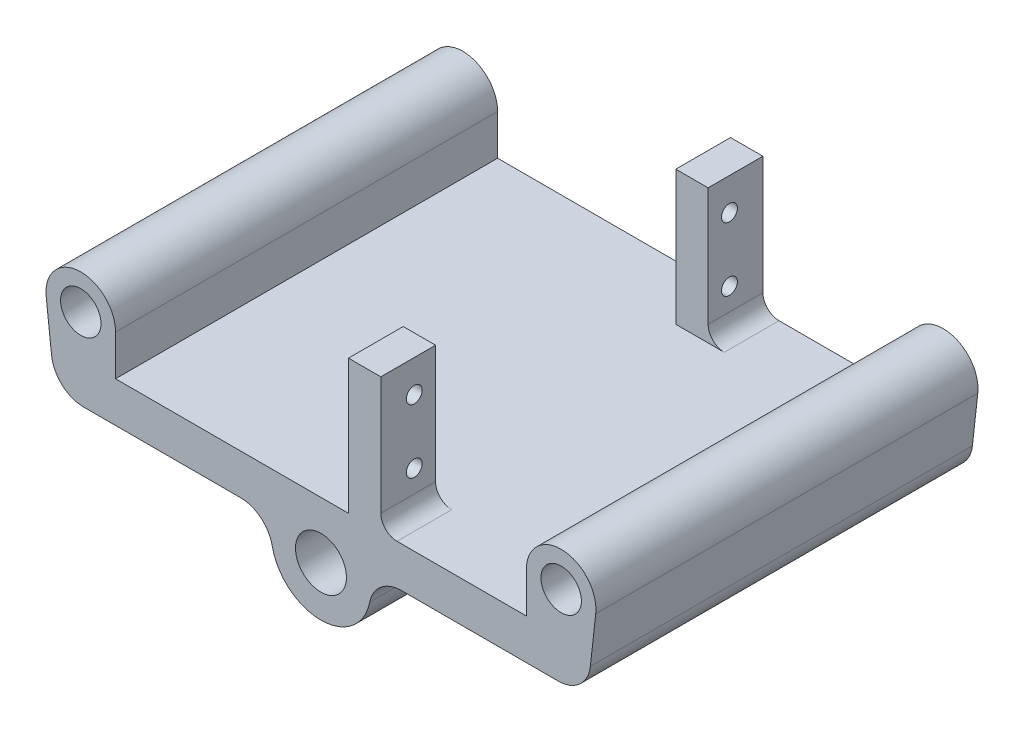
ISO-10303-21;
HEADER;
FILE_DESCRIPTION(('STEP AP214'),'2;1');
FILE_NAME('part.step','',(''),(''),'','','');
FILE_SCHEMA(('AUTOMOTIVE_DESIGN { 1 0 10303 214 1 1 1 1 }'));
ENDSEC;
DATA;
#1=APPLICATION_CONTEXT('core data for automotive mechanical design processes');
#2=APPLICATION_PROTOCOL_DEFINITION('international standard','automotive_design',2000,#1);
#3=PRODUCT_CONTEXT('',#1,'mechanical');
#4=PRODUCT('Part','Part','',(#3));
#5=PRODUCT_RELATED_PRODUCT_CATEGORY('part','',(#4));
#6=PRODUCT_DEFINITION_FORMATION('','',#4);
#7=PRODUCT_DEFINITION_CONTEXT('part definition',#1,'design');
#8=PRODUCT_DEFINITION('design','',#6,#7);
#9=PRODUCT_DEFINITION_SHAPE('','',#8);
#10=(LENGTH_UNIT() NAMED_UNIT(*) SI_UNIT(.MILLI.,.METRE.));
#11=(NAMED_UNIT(*) PLANE_ANGLE_UNIT() SI_UNIT($,.RADIAN.));
#12=(NAMED_UNIT(*) SI_UNIT($,.STERADIAN.) SOLID_ANGLE_UNIT());
#13=UNCERTAINTY_MEASURE_WITH_UNIT(LENGTH_MEASURE(1.E-05),#10,'distance_accuracy_value','');
#14=(GEOMETRIC_REPRESENTATION_CONTEXT(3) GLOBAL_UNCERTAINTY_ASSIGNED_CONTEXT((#13)) GLOBAL_UNIT_ASSIGNED_CONTEXT((#10,
#11,#12)) REPRESENTATION_CONTEXT('',''));
#15=CARTESIAN_POINT('',(0.,0.,0.));
#16=DIRECTION('',(0.,0.,1.));
#17=DIRECTION('',(1.,0.,0.));
#18=AXIS2_PLACEMENT_3D('',#15,#16,#17);
#19=CARTESIAN_POINT('',(32.258,6.35,60.));
#20=DIRECTION('',(0.,-1.,0.));
#21=DIRECTION('',(1.,0.,0.));
#22=AXIS2_PLACEMENT_3D('',#19,#20,#21);
#23=PLANE('',#22);
#24=DIRECTION('',(-1.,0.,0.));
#25=VECTOR('',#24,1.);
#26=CARTESIAN_POINT('',(32.258,6.35,0.));
#27=LINE('',#26,#25);
#28=CARTESIAN_POINT('',(32.258,6.35,0.));
#29=VERTEX_POINT('',#28);
#30=CARTESIAN_POINT('',(11.938,6.35,0.));
#31=VERTEX_POINT('',#30);
#32=EDGE_CURVE('E350',#29,#31,#27,.T.);
#33=ORIENTED_EDGE('',*,*,#32,.T.);
#34=DIRECTION('',(0.,0.,-1.));
#35=VECTOR('',#34,1.);
#36=CARTESIAN_POINT('',(11.938,6.35,8.6));
#37=LINE('',#36,#35);
#38=CARTESIAN_POINT('',(11.938,6.35,8.6));
#39=VERTEX_POINT('',#38);
#40=EDGE_CURVE('E398',#31,#39,#37,.F.);
#41=ORIENTED_EDGE('',*,*,#40,.T.);
#42=DIRECTION('',(1.,0.,0.));
#43=VECTOR('',#42,1.);
#44=CARTESIAN_POINT('',(4.31799999999999,6.35,8.6));
#45=LINE('',#44,#43);
#46=CARTESIAN_POINT('',(4.31799999999999,6.35,8.6));
#47=VERTEX_POINT('',#46);
#48=EDGE_CURVE('E235',#47,#39,#45,.T.);
#49=ORIENTED_EDGE('',*,*,#48,.F.);
#50=DIRECTION('',(0.,0.,1.));
#51=VECTOR('',#50,1.);
#52=CARTESIAN_POINT('',(4.31799999999998,6.35,0.));
#53=LINE('',#52,#51);
#54=CARTESIAN_POINT('',(4.31799999999998,6.35,0.));
#55=VERTEX_POINT('',#54);
#56=EDGE_CURVE('E230',#55,#47,#53,.T.);
#57=ORIENTED_EDGE('',*,*,#56,.F.);
#58=CARTESIAN_POINT('',(-32.258,6.35,0.));
#59=VERTEX_POINT('',#58);
#60=EDGE_CURVE('E376',#55,#59,#27,.T.);
#61=ORIENTED_EDGE('',*,*,#60,.T.);
#62=DIRECTION('',(0.,0.,-1.));
#63=VECTOR('',#62,1.);
#64=CARTESIAN_POINT('',(-32.258,6.35,60.));
#65=LINE('',#64,#63);
#66=CARTESIAN_POINT('',(-32.258,6.35,60.));
#67=VERTEX_POINT('',#66);
#68=EDGE_CURVE('E317',#67,#59,#65,.T.);
#69=ORIENTED_EDGE('',*,*,#68,.F.);
#70=DIRECTION('',(-1.,0.,0.));
#71=VECTOR('',#70,1.);
#72=CARTESIAN_POINT('',(32.258,6.35,60.));
#73=LINE('',#72,#71);
#74=CARTESIAN_POINT('',(4.31799999999998,6.35,60.));
#75=VERTEX_POINT('',#74);
#76=EDGE_CURVE('E359',#75,#67,#73,.T.);
#77=ORIENTED_EDGE('',*,*,#76,.F.);
#78=DIRECTION('',(0.,0.,1.));
#79=VECTOR('',#78,1.);
#80=CARTESIAN_POINT('',(4.31799999999999,6.35,51.4));
#81=LINE('',#80,#79);
#82=CARTESIAN_POINT('',(4.31799999999999,6.35,51.4));
#83=VERTEX_POINT('',#82);
#84=EDGE_CURVE('E228',#83,#75,#81,.T.);
#85=ORIENTED_EDGE('',*,*,#84,.F.);
#86=DIRECTION('',(-1.,0.,0.));
#87=VECTOR('',#86,1.);
#88=CARTESIAN_POINT('',(4.31799999999999,6.35,51.4));
#89=LINE('',#88,#87);
#90=CARTESIAN_POINT('',(11.938,6.35,51.4));
#91=VERTEX_POINT('',#90);
#92=EDGE_CURVE('E224',#91,#83,#89,.T.);
#93=ORIENTED_EDGE('',*,*,#92,.F.);
#94=DIRECTION('',(0.,0.,-1.));
#95=VECTOR('',#94,1.);
#96=CARTESIAN_POINT('',(11.938,6.35,60.));
#97=LINE('',#96,#95);
#98=CARTESIAN_POINT('',(11.938,6.35,60.));
#99=VERTEX_POINT('',#98);
#100=EDGE_CURVE('E395',#91,#99,#97,.F.);
#101=ORIENTED_EDGE('',*,*,#100,.T.);
#102=CARTESIAN_POINT('',(32.258,6.35,60.));
#103=VERTEX_POINT('',#102);
#104=EDGE_CURVE('E360',#103,#99,#73,.T.);
#105=ORIENTED_EDGE('',*,*,#104,.F.);
#106=DIRECTION('',(0.,0.,-1.));
#107=VECTOR('',#106,1.);
#108=CARTESIAN_POINT('',(32.258,6.35,60.));
#109=LINE('',#108,#107);
#110=EDGE_CURVE('E364',#103,#29,#109,.T.);
#111=ORIENTED_EDGE('',*,*,#110,.T.);
#112=EDGE_LOOP('',(#33,#41,#49,#57,#61,#69,#77,#85,#93,#101,#105,#111));
#113=FACE_BOUND('',#112,.T.);
#114=ADVANCED_FACE('F39',(#113),#23,.F.);
#115=CARTESIAN_POINT('',(0.,0.,60.));
#116=DIRECTION('',(0.,-1.,0.));
#117=DIRECTION('',(0.,0.,-1.));
#118=AXIS2_PLACEMENT_3D('',#115,#116,#117);
#119=PLANE('',#118);
#120=DIRECTION('',(-1.,0.,0.));
#121=VECTOR('',#120,1.);
#122=CARTESIAN_POINT('',(0.,0.,60.));
#123=LINE('',#122,#121);
#124=CARTESIAN_POINT('',(-12.6372663183143,0.,60.));
#125=VERTEX_POINT('',#124);
#126=CARTESIAN_POINT('',(-37.2549490920751,0.,60.));
#127=VERTEX_POINT('',#126);
#128=EDGE_CURVE('E293',#125,#127,#123,.T.);
#129=ORIENTED_EDGE('',*,*,#128,.T.);
#130=DIRECTION('',(0.,0.,-1.));
#131=VECTOR('',#130,1.);
#132=CARTESIAN_POINT('',(-37.2549490920751,0.,60.));
#133=LINE('',#132,#131);
#134=CARTESIAN_POINT('',(-37.2549490920751,0.,0.));
#135=VERTEX_POINT('',#134);
#136=EDGE_CURVE('E445',#127,#135,#133,.T.);
#137=ORIENTED_EDGE('',*,*,#136,.T.);
#138=DIRECTION('',(-1.,0.,0.));
#139=VECTOR('',#138,1.);
#140=CARTESIAN_POINT('',(0.,0.,0.));
#141=LINE('',#140,#139);
#142=CARTESIAN_POINT('',(-12.6372663183143,0.,0.));
#143=VERTEX_POINT('',#142);
#144=EDGE_CURVE('E286',#143,#135,#141,.T.);
#145=ORIENTED_EDGE('',*,*,#144,.F.);
#146=DIRECTION('',(0.,0.,1.));
#147=VECTOR('',#146,1.);
#148=CARTESIAN_POINT('',(-12.6372663183143,0.,60.));
#149=LINE('',#148,#147);
#150=EDGE_CURVE('E426',#143,#125,#149,.T.);
#151=ORIENTED_EDGE('',*,*,#150,.T.);
#152=EDGE_LOOP('',(#129,#137,#145,#151));
#153=FACE_BOUND('',#152,.T.);
#154=ADVANCED_FACE('F591',(#153),#119,.T.);
#155=CARTESIAN_POINT('',(37.719,12.7,60.));
#156=DIRECTION('',(0.,0.,1.));
#157=DIRECTION('',(1.,0.,0.));
#158=AXIS2_PLACEMENT_3D('',#155,#156,#157);
#159=PLANE('',#158);
#160=DIRECTION('',(-0.110525955178562,0.99387323800969,0.));
#161=VECTOR('',#160,1.);
#162=CARTESIAN_POINT('',(-41.8013318448109,0.,60.));
#163=LINE('',#162,#161);
#164=CARTESIAN_POINT('',(-42.3038251411643,4.5185281476929,60.));
#165=VERTEX_POINT('',#164);
#166=CARTESIAN_POINT('',(-43.1465417527709,12.0964177587699,60.));
#167=VERTEX_POINT('',#166);
#168=EDGE_CURVE('E290',#165,#167,#163,.T.);
#169=ORIENTED_EDGE('',*,*,#168,.F.);
#170=CARTESIAN_POINT('',(-37.2549490920751,5.08,60.));
#171=DIRECTION('',(0.,0.,1.));
#172=DIRECTION('',(1.,0.,0.));
#173=AXIS2_PLACEMENT_3D('',#170,#171,#172);
#174=CIRCLE('',#173,5.08);
#175=EDGE_CURVE('E460',#165,#127,#174,.T.);
#176=ORIENTED_EDGE('',*,*,#175,.T.);
#177=ORIENTED_EDGE('',*,*,#128,.F.);
#178=CARTESIAN_POINT('',(-12.6372663183143,-5.08,60.));
#179=DIRECTION('',(0.,0.,1.));
#180=DIRECTION('',(1.,0.,0.));
#181=AXIS2_PLACEMENT_3D('',#178,#179,#180);
#182=CIRCLE('',#181,5.08);
#183=CARTESIAN_POINT('',(-7.65686966222144,-4.07897595034911,60.));
#184=VERTEX_POINT('',#183);
#185=EDGE_CURVE('E436',#125,#184,#182,.F.);
#186=ORIENTED_EDGE('',*,*,#185,.T.);
#187=CARTESIAN_POINT('',(0.,-2.54,60.));
#188=DIRECTION('',(0.,0.,1.));
#189=DIRECTION('',(1.,0.,0.));
#190=AXIS2_PLACEMENT_3D('',#187,#188,#189);
#191=CIRCLE('',#190,7.81);
#192=CARTESIAN_POINT('',(7.65686966222144,-4.07897595034911,60.));
#193=VERTEX_POINT('',#192);
#194=EDGE_CURVE('E325',#193,#184,#191,.F.);
#195=ORIENTED_EDGE('',*,*,#194,.F.);
#196=CARTESIAN_POINT('',(12.6372663183143,-5.08,60.));
#197=DIRECTION('',(0.,0.,1.));
#198=DIRECTION('',(1.,0.,0.));
#199=AXIS2_PLACEMENT_3D('',#196,#197,#198);
#200=CIRCLE('',#199,5.08);
#201=CARTESIAN_POINT('',(12.6372663183143,0.,60.));
#202=VERTEX_POINT('',#201);
#203=EDGE_CURVE('E442',#193,#202,#200,.F.);
#204=ORIENTED_EDGE('',*,*,#203,.T.);
#205=DIRECTION('',(1.,0.,0.));
#206=VECTOR('',#205,1.);
#207=CARTESIAN_POINT('',(0.,0.,60.));
#208=LINE('',#207,#206);
#209=CARTESIAN_POINT('',(37.2549490920751,0.,60.));
#210=VERTEX_POINT('',#209);
#211=EDGE_CURVE('E346',#202,#210,#208,.T.);
#212=ORIENTED_EDGE('',*,*,#211,.T.);
#213=CARTESIAN_POINT('',(37.2549490920751,5.08,60.));
#214=DIRECTION('',(0.,0.,1.));
#215=DIRECTION('',(1.,0.,0.));
#216=AXIS2_PLACEMENT_3D('',#213,#214,#215);
#217=CIRCLE('',#216,5.08);
#218=CARTESIAN_POINT('',(42.3038251411643,4.5185281476929,60.));
#219=VERTEX_POINT('',#218);
#220=EDGE_CURVE('E55',#210,#219,#217,.T.);
#221=ORIENTED_EDGE('',*,*,#220,.T.);
#222=DIRECTION('',(0.110525955178562,0.99387323800969,0.));
#223=VECTOR('',#222,1.);
#224=CARTESIAN_POINT('',(41.8013318448109,0.,60.));
#225=LINE('',#224,#223);
#226=CARTESIAN_POINT('',(43.1465417527709,12.0964177587699,60.));
#227=VERTEX_POINT('',#226);
#228=EDGE_CURVE('E349',#219,#227,#225,.T.);
#229=ORIENTED_EDGE('',*,*,#228,.T.);
#230=CARTESIAN_POINT('',(37.719,12.7,60.));
#231=DIRECTION('',(0.,0.,1.));
#232=DIRECTION('',(1.,0.,0.));
#233=AXIS2_PLACEMENT_3D('',#230,#231,#232);
#234=CIRCLE('',#233,5.461);
#235=CARTESIAN_POINT('',(32.258,12.7,60.));
#236=VERTEX_POINT('',#235);
#237=EDGE_CURVE('E353',#227,#236,#234,.T.);
#238=ORIENTED_EDGE('',*,*,#237,.T.);
#239=DIRECTION('',(0.,-1.,0.));
#240=VECTOR('',#239,1.);
#241=CARTESIAN_POINT('',(32.258,12.7,60.));
#242=LINE('',#241,#240);
#243=EDGE_CURVE('E356',#236,#103,#242,.T.);
#244=ORIENTED_EDGE('',*,*,#243,.T.);
#245=ORIENTED_EDGE('',*,*,#104,.T.);
#246=CARTESIAN_POINT('',(11.938,8.89,60.));
#247=DIRECTION('',(0.,0.,1.));
#248=DIRECTION('',(1.,0.,0.));
#249=AXIS2_PLACEMENT_3D('',#246,#247,#248);
#250=CIRCLE('',#249,2.54);
#251=CARTESIAN_POINT('',(9.39799999999999,8.89,60.));
#252=VERTEX_POINT('',#251);
#253=EDGE_CURVE('E416',#99,#252,#250,.F.);
#254=ORIENTED_EDGE('',*,*,#253,.T.);
#255=DIRECTION('',(0.,-1.,0.));
#256=VECTOR('',#255,1.);
#257=CARTESIAN_POINT('',(9.39799999999999,27.45,60.));
#258=LINE('',#257,#256);
#259=CARTESIAN_POINT('',(9.39799999999999,27.45,60.));
#260=VERTEX_POINT('',#259);
#261=EDGE_CURVE('E209',#260,#252,#258,.T.);
#262=ORIENTED_EDGE('',*,*,#261,.F.);
#263=DIRECTION('',(1.,0.,0.));
#264=VECTOR('',#263,1.);
#265=CARTESIAN_POINT('',(4.31799999999998,27.45,60.));
#266=LINE('',#265,#264);
#267=CARTESIAN_POINT('',(4.31799999999998,27.45,60.));
#268=VERTEX_POINT('',#267);
#269=EDGE_CURVE('E200',#268,#260,#266,.T.);
#270=ORIENTED_EDGE('',*,*,#269,.F.);
#271=DIRECTION('',(0.,-1.,0.));
#272=VECTOR('',#271,1.);
#273=CARTESIAN_POINT('',(4.31799999999998,27.45,60.));
#274=LINE('',#273,#272);
#275=EDGE_CURVE('E206',#268,#75,#274,.T.);
#276=ORIENTED_EDGE('',*,*,#275,.T.);
#277=ORIENTED_EDGE('',*,*,#76,.T.);
#278=DIRECTION('',(0.,-1.,0.));
#279=VECTOR('',#278,1.);
#280=CARTESIAN_POINT('',(-32.258,12.7,60.));
#281=LINE('',#280,#279);
#282=CARTESIAN_POINT('',(-32.258,12.7,60.));
#283=VERTEX_POINT('',#282);
#284=EDGE_CURVE('E281',#283,#67,#281,.T.);
#285=ORIENTED_EDGE('',*,*,#284,.F.);
#286=CARTESIAN_POINT('',(-37.719,12.7,60.));
#287=DIRECTION('',(0.,0.,-1.));
#288=DIRECTION('',(-1.,0.,0.));
#289=AXIS2_PLACEMENT_3D('',#286,#287,#288);
#290=CIRCLE('',#289,5.461);
#291=EDGE_CURVE('E285',#167,#283,#290,.T.);
#292=ORIENTED_EDGE('',*,*,#291,.F.);
#293=EDGE_LOOP('',(#169,#176,#177,#186,#195,#204,#212,#221,#229,#238,#244,#245,#254,#262,#270,
#276,#277,#285,#292));
#294=FACE_BOUND('',#293,.T.);
#295=CARTESIAN_POINT('',(37.719,12.7,60.));
#296=DIRECTION('',(0.,0.,1.));
#297=DIRECTION('',(1.,0.,0.));
#298=AXIS2_PLACEMENT_3D('',#295,#296,#297);
#299=CIRCLE('',#298,3.175);
#300=CARTESIAN_POINT('',(40.894,12.7,60.));
#301=VERTEX_POINT('',#300);
#302=EDGE_CURVE('E338',#301,#301,#299,.T.);
#303=ORIENTED_EDGE('',*,*,#302,.F.);
#304=EDGE_LOOP('',(#303));
#305=FACE_BOUND('',#304,.T.);
#306=CARTESIAN_POINT('',(-37.719,12.7,60.));
#307=DIRECTION('',(0.,0.,-1.));
#308=DIRECTION('',(-1.,0.,0.));
#309=AXIS2_PLACEMENT_3D('',#306,#307,#308);
#310=CIRCLE('',#309,3.175);
#311=CARTESIAN_POINT('',(-40.894,12.7,60.));
#312=VERTEX_POINT('',#311);
#313=EDGE_CURVE('E273',#312,#312,#310,.T.);
#314=ORIENTED_EDGE('',*,*,#313,.T.);
#315=EDGE_LOOP('',(#314));
#316=FACE_BOUND('',#315,.T.);
#317=CARTESIAN_POINT('',(0.,-2.54,60.));
#318=DIRECTION('',(0.,0.,-1.));
#319=DIRECTION('',(-1.,0.,0.));
#320=AXIS2_PLACEMENT_3D('',#317,#318,#319);
#321=CIRCLE('',#320,4.);
#322=CARTESIAN_POINT('',(-4.,-2.54,60.));
#323=VERTEX_POINT('',#322);
#324=EDGE_CURVE('E330',#323,#323,#321,.T.);
#325=ORIENTED_EDGE('',*,*,#324,.T.);
#326=EDGE_LOOP('',(#325));
#327=FACE_BOUND('',#326,.T.);
#328=ADVANCED_FACE('F203',(#294,#305,#316,#327),#159,.T.);
#329=CARTESIAN_POINT('',(37.719,12.7,0.));
#330=DIRECTION('',(0.,0.,1.));
#331=DIRECTION('',(1.,0.,0.));
#332=AXIS2_PLACEMENT_3D('',#329,#330,#331);
#333=PLANE('',#332);
#334=ORIENTED_EDGE('',*,*,#144,.T.);
#335=CARTESIAN_POINT('',(-37.2549490920751,5.08,0.));
#336=DIRECTION('',(0.,0.,1.));
#337=DIRECTION('',(1.,0.,0.));
#338=AXIS2_PLACEMENT_3D('',#335,#336,#337);
#339=CIRCLE('',#338,5.08);
#340=CARTESIAN_POINT('',(-42.3038251411643,4.5185281476929,0.));
#341=VERTEX_POINT('',#340);
#342=EDGE_CURVE('E452',#135,#341,#339,.F.);
#343=ORIENTED_EDGE('',*,*,#342,.T.);
#344=DIRECTION('',(-0.110525955178562,0.99387323800969,0.));
#345=VECTOR('',#344,1.);
#346=CARTESIAN_POINT('',(-41.8013318448109,0.,0.));
#347=LINE('',#346,#345);
#348=CARTESIAN_POINT('',(-43.1465417527709,12.0964177587699,0.));
#349=VERTEX_POINT('',#348);
#350=EDGE_CURVE('E305',#341,#349,#347,.T.);
#351=ORIENTED_EDGE('',*,*,#350,.T.);
#352=CARTESIAN_POINT('',(-37.719,12.7,0.));
#353=DIRECTION('',(0.,0.,-1.));
#354=DIRECTION('',(-1.,0.,0.));
#355=AXIS2_PLACEMENT_3D('',#352,#353,#354);
#356=CIRCLE('',#355,5.461);
#357=CARTESIAN_POINT('',(-32.258,12.7,0.));
#358=VERTEX_POINT('',#357);
#359=EDGE_CURVE('E301',#349,#358,#356,.T.);
#360=ORIENTED_EDGE('',*,*,#359,.T.);
#361=DIRECTION('',(0.,-1.,0.));
#362=VECTOR('',#361,1.);
#363=CARTESIAN_POINT('',(-32.258,12.7,0.));
#364=LINE('',#363,#362);
#365=EDGE_CURVE('E277',#358,#59,#364,.T.);
#366=ORIENTED_EDGE('',*,*,#365,.T.);
#367=ORIENTED_EDGE('',*,*,#60,.F.);
#368=DIRECTION('',(0.,-1.,0.));
#369=VECTOR('',#368,1.);
#370=CARTESIAN_POINT('',(4.31799999999998,27.45,0.));
#371=LINE('',#370,#369);
#372=CARTESIAN_POINT('',(4.31799999999998,27.45,0.));
#373=VERTEX_POINT('',#372);
#374=EDGE_CURVE('E253',#373,#55,#371,.T.);
#375=ORIENTED_EDGE('',*,*,#374,.F.);
#376=DIRECTION('',(-1.,0.,0.));
#377=VECTOR('',#376,1.);
#378=CARTESIAN_POINT('',(4.31799999999998,27.45,0.));
#379=LINE('',#378,#377);
#380=CARTESIAN_POINT('',(9.39799999999998,27.45,0.));
#381=VERTEX_POINT('',#380);
#382=EDGE_CURVE('E251',#381,#373,#379,.T.);
#383=ORIENTED_EDGE('',*,*,#382,.F.);
#384=DIRECTION('',(0.,-1.,0.));
#385=VECTOR('',#384,1.);
#386=CARTESIAN_POINT('',(9.39799999999998,27.45,0.));
#387=LINE('',#386,#385);
#388=CARTESIAN_POINT('',(9.39799999999999,8.89,0.));
#389=VERTEX_POINT('',#388);
#390=EDGE_CURVE('E260',#381,#389,#387,.T.);
#391=ORIENTED_EDGE('',*,*,#390,.T.);
#392=CARTESIAN_POINT('',(11.938,8.89,0.));
#393=DIRECTION('',(0.,0.,1.));
#394=DIRECTION('',(1.,0.,0.));
#395=AXIS2_PLACEMENT_3D('',#392,#393,#394);
#396=CIRCLE('',#395,2.54);
#397=EDGE_CURVE('E406',#389,#31,#396,.T.);
#398=ORIENTED_EDGE('',*,*,#397,.T.);
#399=ORIENTED_EDGE('',*,*,#32,.F.);
#400=DIRECTION('',(0.,-1.,0.));
#401=VECTOR('',#400,1.);
#402=CARTESIAN_POINT('',(32.258,12.7,0.));
#403=LINE('',#402,#401);
#404=CARTESIAN_POINT('',(32.258,12.7,0.));
#405=VERTEX_POINT('',#404);
#406=EDGE_CURVE('E373',#405,#29,#403,.T.);
#407=ORIENTED_EDGE('',*,*,#406,.F.);
#408=CARTESIAN_POINT('',(37.719,12.7,0.));
#409=DIRECTION('',(0.,0.,1.));
#410=DIRECTION('',(1.,0.,0.));
#411=AXIS2_PLACEMENT_3D('',#408,#409,#410);
#412=CIRCLE('',#411,5.461);
#413=CARTESIAN_POINT('',(43.1465417527709,12.0964177587699,0.));
#414=VERTEX_POINT('',#413);
#415=EDGE_CURVE('E370',#414,#405,#412,.T.);
#416=ORIENTED_EDGE('',*,*,#415,.F.);
#417=DIRECTION('',(0.110525955178562,0.99387323800969,0.));
#418=VECTOR('',#417,1.);
#419=CARTESIAN_POINT('',(41.8013318448109,0.,0.));
#420=LINE('',#419,#418);
#421=CARTESIAN_POINT('',(42.3038251411643,4.5185281476929,0.));
#422=VERTEX_POINT('',#421);
#423=EDGE_CURVE('E367',#422,#414,#420,.T.);
#424=ORIENTED_EDGE('',*,*,#423,.F.);
#425=CARTESIAN_POINT('',(37.2549490920751,5.08,0.));
#426=DIRECTION('',(0.,0.,1.));
#427=DIRECTION('',(1.,0.,0.));
#428=AXIS2_PLACEMENT_3D('',#425,#426,#427);
#429=CIRCLE('',#428,5.08);
#430=CARTESIAN_POINT('',(37.2549490920751,0.,0.));
#431=VERTEX_POINT('',#430);
#432=EDGE_CURVE('E449',#422,#431,#429,.F.);
#433=ORIENTED_EDGE('',*,*,#432,.T.);
#434=DIRECTION('',(1.,0.,0.));
#435=VECTOR('',#434,1.);
#436=CARTESIAN_POINT('',(0.,0.,0.));
#437=LINE('',#436,#435);
#438=CARTESIAN_POINT('',(12.6372663183143,0.,0.));
#439=VERTEX_POINT('',#438);
#440=EDGE_CURVE('E342',#439,#431,#437,.T.);
#441=ORIENTED_EDGE('',*,*,#440,.F.);
#442=CARTESIAN_POINT('',(12.6372663183143,-5.08,0.));
#443=DIRECTION('',(0.,0.,1.));
#444=DIRECTION('',(1.,0.,0.));
#445=AXIS2_PLACEMENT_3D('',#442,#443,#444);
#446=CIRCLE('',#445,5.08);
#447=CARTESIAN_POINT('',(7.65686966222144,-4.07897595034911,0.));
#448=VERTEX_POINT('',#447);
#449=EDGE_CURVE('E439',#439,#448,#446,.T.);
#450=ORIENTED_EDGE('',*,*,#449,.T.);
#451=CARTESIAN_POINT('',(0.,-2.54,0.));
#452=DIRECTION('',(0.,0.,-1.));
#453=DIRECTION('',(-1.,0.,0.));
#454=AXIS2_PLACEMENT_3D('',#451,#452,#453);
#455=CIRCLE('',#454,7.81);
#456=CARTESIAN_POINT('',(-7.65686966222144,-4.07897595034911,0.));
#457=VERTEX_POINT('',#456);
#458=EDGE_CURVE('E321',#448,#457,#455,.T.);
#459=ORIENTED_EDGE('',*,*,#458,.T.);
#460=CARTESIAN_POINT('',(-12.6372663183143,-5.08,0.));
#461=DIRECTION('',(0.,0.,1.));
#462=DIRECTION('',(1.,0.,0.));
#463=AXIS2_PLACEMENT_3D('',#460,#461,#462);
#464=CIRCLE('',#463,5.08);
#465=EDGE_CURVE('E433',#457,#143,#464,.T.);
#466=ORIENTED_EDGE('',*,*,#465,.T.);
#467=EDGE_LOOP('',(#334,#343,#351,#360,#366,#367,#375,#383,#391,#398,#399,#407,#416,#424,#433,
#441,#450,#459,#466));
#468=FACE_BOUND('',#467,.T.);
#469=CARTESIAN_POINT('',(-37.719,12.7,0.));
#470=DIRECTION('',(0.,0.,-1.));
#471=DIRECTION('',(-1.,0.,0.));
#472=AXIS2_PLACEMENT_3D('',#469,#470,#471);
#473=CIRCLE('',#472,3.175);
#474=CARTESIAN_POINT('',(-40.894,12.7,0.));
#475=VERTEX_POINT('',#474);
#476=EDGE_CURVE('E272',#475,#475,#473,.T.);
#477=ORIENTED_EDGE('',*,*,#476,.F.);
#478=EDGE_LOOP('',(#477));
#479=FACE_BOUND('',#478,.T.);
#480=CARTESIAN_POINT('',(37.719,12.7,0.));
#481=DIRECTION('',(0.,0.,1.));
#482=DIRECTION('',(1.,0.,0.));
#483=AXIS2_PLACEMENT_3D('',#480,#481,#482);
#484=CIRCLE('',#483,3.175);
#485=CARTESIAN_POINT('',(40.894,12.7,0.));
#486=VERTEX_POINT('',#485);
#487=EDGE_CURVE('E334',#486,#486,#484,.T.);
#488=ORIENTED_EDGE('',*,*,#487,.T.);
#489=EDGE_LOOP('',(#488));
#490=FACE_BOUND('',#489,.T.);
#491=CARTESIAN_POINT('',(0.,-2.54,0.));
#492=DIRECTION('',(0.,0.,-1.));
#493=DIRECTION('',(-1.,0.,0.));
#494=AXIS2_PLACEMENT_3D('',#491,#492,#493);
#495=CIRCLE('',#494,4.);
#496=CARTESIAN_POINT('',(-4.,-2.54,0.));
#497=VERTEX_POINT('',#496);
#498=EDGE_CURVE('E329',#497,#497,#495,.T.);
#499=ORIENTED_EDGE('',*,*,#498,.F.);
#500=EDGE_LOOP('',(#499));
#501=FACE_BOUND('',#500,.T.);
#502=ADVANCED_FACE('F472',(#468,#479,#490,#501),#333,.F.);
#503=CARTESIAN_POINT('',(0.,0.,60.));
#504=DIRECTION('',(0.,1.,0.));
#505=DIRECTION('',(0.,0.,1.));
#506=AXIS2_PLACEMENT_3D('',#503,#504,#505);
#507=PLANE('',#506);
#508=ORIENTED_EDGE('',*,*,#440,.T.);
#509=DIRECTION('',(0.,0.,-1.));
#510=VECTOR('',#509,1.);
#511=CARTESIAN_POINT('',(37.2549490920751,0.,60.));
#512=LINE('',#511,#510);
#513=EDGE_CURVE('E11',#431,#210,#512,.F.);
#514=ORIENTED_EDGE('',*,*,#513,.T.);
#515=ORIENTED_EDGE('',*,*,#211,.F.);
#516=DIRECTION('',(0.,0.,-1.));
#517=VECTOR('',#516,1.);
#518=CARTESIAN_POINT('',(12.6372663183143,0.,60.));
#519=LINE('',#518,#517);
#520=EDGE_CURVE('E429',#202,#439,#519,.T.);
#521=ORIENTED_EDGE('',*,*,#520,.T.);
#522=EDGE_LOOP('',(#508,#514,#515,#521));
#523=FACE_BOUND('',#522,.T.);
#524=ADVANCED_FACE('F607',(#523),#507,.F.);
#525=CARTESIAN_POINT('',(41.8013318448109,0.,60.));
#526=DIRECTION('',(-0.99387323800969,0.110525955178562,0.));
#527=DIRECTION('',(-0.110525955178562,-0.99387323800969,0.));
#528=AXIS2_PLACEMENT_3D('',#525,#526,#527);
#529=PLANE('',#528);
#530=ORIENTED_EDGE('',*,*,#228,.F.);
#531=DIRECTION('',(0.,0.,-1.));
#532=VECTOR('',#531,1.);
#533=CARTESIAN_POINT('',(42.3038251411643,4.5185281476929,60.));
#534=LINE('',#533,#532);
#535=EDGE_CURVE('E48',#219,#422,#534,.T.);
#536=ORIENTED_EDGE('',*,*,#535,.T.);
#537=ORIENTED_EDGE('',*,*,#423,.T.);
#538=DIRECTION('',(0.,0.,-1.));
#539=VECTOR('',#538,1.);
#540=CARTESIAN_POINT('',(43.1465417527709,12.0964177587699,60.));
#541=LINE('',#540,#539);
#542=EDGE_CURVE('E387',#227,#414,#541,.T.);
#543=ORIENTED_EDGE('',*,*,#542,.F.);
#544=EDGE_LOOP('',(#530,#536,#537,#543));
#545=FACE_BOUND('',#544,.T.);
#546=ADVANCED_FACE('F467',(#545),#529,.F.);
#547=CARTESIAN_POINT('',(37.719,12.7,60.));
#548=DIRECTION('',(0.,0.,-1.));
#549=DIRECTION('',(-1.,0.,0.));
#550=AXIS2_PLACEMENT_3D('',#547,#548,#549);
#551=CYLINDRICAL_SURFACE('',#550,5.461);
#552=ORIENTED_EDGE('',*,*,#415,.T.);
#553=DIRECTION('',(0.,0.,-1.));
#554=VECTOR('',#553,1.);
#555=CARTESIAN_POINT('',(32.258,12.7,60.));
#556=LINE('',#555,#554);
#557=EDGE_CURVE('E383',#236,#405,#556,.T.);
#558=ORIENTED_EDGE('',*,*,#557,.F.);
#559=ORIENTED_EDGE('',*,*,#237,.F.);
#560=ORIENTED_EDGE('',*,*,#542,.T.);
#561=EDGE_LOOP('',(#552,#558,#559,#560));
#562=FACE_BOUND('',#561,.T.);
#563=ADVANCED_FACE('F479',(#562),#551,.T.);
#564=CARTESIAN_POINT('',(32.258,12.7,60.));
#565=DIRECTION('',(1.,0.,0.));
#566=DIRECTION('',(0.,0.,-1.));
#567=AXIS2_PLACEMENT_3D('',#564,#565,#566);
#568=PLANE('',#567);
#569=ORIENTED_EDGE('',*,*,#406,.T.);
#570=ORIENTED_EDGE('',*,*,#110,.F.);
#571=ORIENTED_EDGE('',*,*,#243,.F.);
#572=ORIENTED_EDGE('',*,*,#557,.T.);
#573=EDGE_LOOP('',(#569,#570,#571,#572));
#574=FACE_BOUND('',#573,.T.);
#575=ADVANCED_FACE('F483',(#574),#568,.F.);
#576=CARTESIAN_POINT('',(37.719,12.7,60.));
#577=DIRECTION('',(0.,0.,-1.));
#578=DIRECTION('',(-1.,0.,0.));
#579=AXIS2_PLACEMENT_3D('',#576,#577,#578);
#580=CYLINDRICAL_SURFACE('',#579,3.175);
#581=ORIENTED_EDGE('',*,*,#302,.T.);
#582=EDGE_LOOP('',(#581));
#583=FACE_BOUND('',#582,.T.);
#584=ORIENTED_EDGE('',*,*,#487,.F.);
#585=EDGE_LOOP('',(#584));
#586=FACE_BOUND('',#585,.T.);
#587=ADVANCED_FACE('F623',(#583,#586),#580,.F.);
#588=CARTESIAN_POINT('',(0.,-2.54,60.));
#589=DIRECTION('',(0.,0.,-1.));
#590=DIRECTION('',(-1.,0.,0.));
#591=AXIS2_PLACEMENT_3D('',#588,#589,#590);
#592=CYLINDRICAL_SURFACE('',#591,4.);
#593=ORIENTED_EDGE('',*,*,#324,.F.);
#594=EDGE_LOOP('',(#593));
#595=FACE_BOUND('',#594,.T.);
#596=ORIENTED_EDGE('',*,*,#498,.T.);
#597=EDGE_LOOP('',(#596));
#598=FACE_BOUND('',#597,.T.);
#599=ADVANCED_FACE('F706',(#595,#598),#592,.F.);
#600=CARTESIAN_POINT('',(0.,-2.54,72.9660556839773));
#601=DIRECTION('',(0.,0.,-1.));
#602=DIRECTION('',(-1.,0.,0.));
#603=AXIS2_PLACEMENT_3D('',#600,#601,#602);
#604=CYLINDRICAL_SURFACE('',#603,7.81);
#605=ORIENTED_EDGE('',*,*,#194,.T.);
#606=DIRECTION('',(0.,0.,-1.));
#607=VECTOR('',#606,1.);
#608=CARTESIAN_POINT('',(-7.65686966222144,-4.07897595034911,72.9660556839773));
#609=LINE('',#608,#607);
#610=EDGE_CURVE('E422',#184,#457,#609,.T.);
#611=ORIENTED_EDGE('',*,*,#610,.T.);
#612=ORIENTED_EDGE('',*,*,#458,.F.);
#613=DIRECTION('',(0.,0.,-1.));
#614=VECTOR('',#613,1.);
#615=CARTESIAN_POINT('',(7.65686966222144,-4.07897595034911,72.9660556839773));
#616=LINE('',#615,#614);
#617=EDGE_CURVE('E419',#448,#193,#616,.F.);
#618=ORIENTED_EDGE('',*,*,#617,.T.);
#619=EDGE_LOOP('',(#605,#611,#612,#618));
#620=FACE_BOUND('',#619,.T.);
#621=ADVANCED_FACE('F600',(#620),#604,.T.);
#622=CARTESIAN_POINT('',(-32.258,12.7,60.));
#623=DIRECTION('',(1.,0.,0.));
#624=DIRECTION('',(0.,0.,-1.));
#625=AXIS2_PLACEMENT_3D('',#622,#623,#624);
#626=PLANE('',#625);
#627=ORIENTED_EDGE('',*,*,#365,.F.);
#628=DIRECTION('',(0.,0.,-1.));
#629=VECTOR('',#628,1.);
#630=CARTESIAN_POINT('',(-32.258,12.7,60.));
#631=LINE('',#630,#629);
#632=EDGE_CURVE('E314',#283,#358,#631,.T.);
#633=ORIENTED_EDGE('',*,*,#632,.F.);
#634=ORIENTED_EDGE('',*,*,#284,.T.);
#635=ORIENTED_EDGE('',*,*,#68,.T.);
#636=EDGE_LOOP('',(#627,#633,#634,#635));
#637=FACE_BOUND('',#636,.T.);
#638=ADVANCED_FACE('F577',(#637),#626,.T.);
#639=CARTESIAN_POINT('',(-37.719,12.7,60.));
#640=DIRECTION('',(0.,0.,-1.));
#641=DIRECTION('',(-1.,0.,0.));
#642=AXIS2_PLACEMENT_3D('',#639,#640,#641);
#643=CYLINDRICAL_SURFACE('',#642,5.461);
#644=ORIENTED_EDGE('',*,*,#359,.F.);
#645=DIRECTION('',(0.,0.,-1.));
#646=VECTOR('',#645,1.);
#647=CARTESIAN_POINT('',(-43.1465417527709,12.0964177587699,60.));
#648=LINE('',#647,#646);
#649=EDGE_CURVE('E297',#167,#349,#648,.T.);
#650=ORIENTED_EDGE('',*,*,#649,.F.);
#651=ORIENTED_EDGE('',*,*,#291,.T.);
#652=ORIENTED_EDGE('',*,*,#632,.T.);
#653=EDGE_LOOP('',(#644,#650,#651,#652));
#654=FACE_BOUND('',#653,.T.);
#655=ADVANCED_FACE('F580',(#654),#643,.T.);
#656=CARTESIAN_POINT('',(-41.8013318448109,0.,60.));
#657=DIRECTION('',(-0.99387323800969,-0.110525955178562,0.));
#658=DIRECTION('',(0.110525955178562,-0.99387323800969,0.));
#659=AXIS2_PLACEMENT_3D('',#656,#657,#658);
#660=PLANE('',#659);
#661=ORIENTED_EDGE('',*,*,#350,.F.);
#662=DIRECTION('',(0.,0.,-1.));
#663=VECTOR('',#662,1.);
#664=CARTESIAN_POINT('',(-42.3038251411643,4.51852814769291,60.));
#665=LINE('',#664,#663);
#666=EDGE_CURVE('E455',#341,#165,#665,.F.);
#667=ORIENTED_EDGE('',*,*,#666,.T.);
#668=ORIENTED_EDGE('',*,*,#168,.T.);
#669=ORIENTED_EDGE('',*,*,#649,.T.);
#670=EDGE_LOOP('',(#661,#667,#668,#669));
#671=FACE_BOUND('',#670,.T.);
#672=ADVANCED_FACE('F653',(#671),#660,.T.);
#673=CARTESIAN_POINT('',(-37.719,12.7,60.));
#674=DIRECTION('',(0.,0.,-1.));
#675=DIRECTION('',(-1.,0.,0.));
#676=AXIS2_PLACEMENT_3D('',#673,#674,#675);
#677=CYLINDRICAL_SURFACE('',#676,3.175);
#678=ORIENTED_EDGE('',*,*,#313,.F.);
#679=EDGE_LOOP('',(#678));
#680=FACE_BOUND('',#679,.T.);
#681=ORIENTED_EDGE('',*,*,#476,.T.);
#682=EDGE_LOOP('',(#681));
#683=FACE_BOUND('',#682,.T.);
#684=ADVANCED_FACE('F661',(#680,#683),#677,.F.);
#685=CARTESIAN_POINT('',(4.31799999999998,27.45,0.));
#686=DIRECTION('',(1.,0.,0.));
#687=DIRECTION('',(0.,0.,-1.));
#688=AXIS2_PLACEMENT_3D('',#685,#686,#687);
#689=PLANE('',#688);
#690=CARTESIAN_POINT('',(4.31799999999998,12.4,5.24999999999999));
#691=DIRECTION('',(1.,0.,0.));
#692=DIRECTION('',(0.,0.,-1.));
#693=AXIS2_PLACEMENT_3D('',#690,#691,#692);
#694=CIRCLE('',#693,1.25);
#695=CARTESIAN_POINT('',(4.31799999999998,12.4,3.99999999999999));
#696=VERTEX_POINT('',#695);
#697=EDGE_CURVE('E524',#696,#696,#694,.F.);
#698=ORIENTED_EDGE('',*,*,#697,.F.);
#699=EDGE_LOOP('',(#698));
#700=FACE_BOUND('',#699,.T.);
#701=CARTESIAN_POINT('',(4.31799999999998,22.4,5.24999999999999));
#702=DIRECTION('',(1.,0.,0.));
#703=DIRECTION('',(0.,0.,-1.));
#704=AXIS2_PLACEMENT_3D('',#701,#702,#703);
#705=CIRCLE('',#704,1.25);
#706=CARTESIAN_POINT('',(4.31799999999998,22.4,3.99999999999999));
#707=VERTEX_POINT('',#706);
#708=EDGE_CURVE('E519',#707,#707,#705,.F.);
#709=ORIENTED_EDGE('',*,*,#708,.F.);
#710=EDGE_LOOP('',(#709));
#711=FACE_BOUND('',#710,.T.);
#712=ORIENTED_EDGE('',*,*,#56,.T.);
#713=DIRECTION('',(0.,-1.,0.));
#714=VECTOR('',#713,1.);
#715=CARTESIAN_POINT('',(4.31799999999998,27.45,8.6));
#716=LINE('',#715,#714);
#717=CARTESIAN_POINT('',(4.31799999999998,27.45,8.6));
#718=VERTEX_POINT('',#717);
#719=EDGE_CURVE('E268',#718,#47,#716,.T.);
#720=ORIENTED_EDGE('',*,*,#719,.F.);
#721=DIRECTION('',(0.,0.,1.));
#722=VECTOR('',#721,1.);
#723=CARTESIAN_POINT('',(4.31799999999998,27.45,0.));
#724=LINE('',#723,#722);
#725=EDGE_CURVE('E241',#373,#718,#724,.T.);
#726=ORIENTED_EDGE('',*,*,#725,.F.);
#727=ORIENTED_EDGE('',*,*,#374,.T.);
#728=EDGE_LOOP('',(#712,#720,#726,#727));
#729=FACE_BOUND('',#728,.T.);
#730=ADVANCED_FACE('F568',(#700,#711,#729),#689,.F.);
#731=CARTESIAN_POINT('',(4.31799999999998,27.45,8.6));
#732=DIRECTION('',(0.,0.,-1.));
#733=DIRECTION('',(-1.,0.,0.));
#734=AXIS2_PLACEMENT_3D('',#731,#732,#733);
#735=PLANE('',#734);
#736=ORIENTED_EDGE('',*,*,#48,.T.);
#737=CARTESIAN_POINT('',(11.938,8.89,8.6));
#738=DIRECTION('',(0.,0.,-1.));
#739=DIRECTION('',(-1.,0.,0.));
#740=AXIS2_PLACEMENT_3D('',#737,#738,#739);
#741=CIRCLE('',#740,2.54);
#742=CARTESIAN_POINT('',(9.39799999999998,8.89,8.6));
#743=VERTEX_POINT('',#742);
#744=EDGE_CURVE('E409',#39,#743,#741,.T.);
#745=ORIENTED_EDGE('',*,*,#744,.T.);
#746=DIRECTION('',(0.,-1.,0.));
#747=VECTOR('',#746,1.);
#748=CARTESIAN_POINT('',(9.39799999999998,27.45,8.6));
#749=LINE('',#748,#747);
#750=CARTESIAN_POINT('',(9.39799999999998,27.45,8.6));
#751=VERTEX_POINT('',#750);
#752=EDGE_CURVE('E264',#751,#743,#749,.T.);
#753=ORIENTED_EDGE('',*,*,#752,.F.);
#754=DIRECTION('',(1.,0.,0.));
#755=VECTOR('',#754,1.);
#756=CARTESIAN_POINT('',(4.31799999999998,27.45,8.6));
#757=LINE('',#756,#755);
#758=EDGE_CURVE('E245',#718,#751,#757,.T.);
#759=ORIENTED_EDGE('',*,*,#758,.F.);
#760=ORIENTED_EDGE('',*,*,#719,.T.);
#761=EDGE_LOOP('',(#736,#745,#753,#759,#760));
#762=FACE_BOUND('',#761,.T.);
#763=ADVANCED_FACE('F551',(#762),#735,.F.);
#764=CARTESIAN_POINT('',(9.39799999999998,27.45,0.));
#765=DIRECTION('',(-1.,0.,0.));
#766=DIRECTION('',(0.,0.,1.));
#767=AXIS2_PLACEMENT_3D('',#764,#765,#766);
#768=PLANE('',#767);
#769=CARTESIAN_POINT('',(9.39799999999997,12.4,5.24999999999999));
#770=DIRECTION('',(1.,0.,0.));
#771=DIRECTION('',(0.,0.,-1.));
#772=AXIS2_PLACEMENT_3D('',#769,#770,#771);
#773=CIRCLE('',#772,1.25);
#774=CARTESIAN_POINT('',(9.39799999999997,12.4,3.99999999999999));
#775=VERTEX_POINT('',#774);
#776=EDGE_CURVE('E529',#775,#775,#773,.T.);
#777=ORIENTED_EDGE('',*,*,#776,.F.);
#778=EDGE_LOOP('',(#777));
#779=FACE_BOUND('',#778,.T.);
#780=CARTESIAN_POINT('',(9.39799999999996,22.4,5.24999999999999));
#781=DIRECTION('',(1.,0.,0.));
#782=DIRECTION('',(0.,0.,-1.));
#783=AXIS2_PLACEMENT_3D('',#780,#781,#782);
#784=CIRCLE('',#783,1.25);
#785=CARTESIAN_POINT('',(9.39799999999996,22.4,3.99999999999999));
#786=VERTEX_POINT('',#785);
#787=EDGE_CURVE('E533',#786,#786,#784,.T.);
#788=ORIENTED_EDGE('',*,*,#787,.F.);
#789=EDGE_LOOP('',(#788));
#790=FACE_BOUND('',#789,.T.);
#791=ORIENTED_EDGE('',*,*,#752,.T.);
#792=DIRECTION('',(0.,0.,-1.));
#793=VECTOR('',#792,1.);
#794=CARTESIAN_POINT('',(9.39799999999999,8.89,0.));
#795=LINE('',#794,#793);
#796=EDGE_CURVE('E391',#743,#389,#795,.T.);
#797=ORIENTED_EDGE('',*,*,#796,.T.);
#798=ORIENTED_EDGE('',*,*,#390,.F.);
#799=DIRECTION('',(0.,0.,-1.));
#800=VECTOR('',#799,1.);
#801=CARTESIAN_POINT('',(9.39799999999998,27.45,0.));
#802=LINE('',#801,#800);
#803=EDGE_CURVE('E248',#751,#381,#802,.T.);
#804=ORIENTED_EDGE('',*,*,#803,.F.);
#805=EDGE_LOOP('',(#791,#797,#798,#804));
#806=FACE_BOUND('',#805,.T.);
#807=ADVANCED_FACE('F547',(#779,#790,#806),#768,.F.);
#808=CARTESIAN_POINT('',(0.,27.45,0.));
#809=DIRECTION('',(0.,1.,0.));
#810=DIRECTION('',(0.,0.,1.));
#811=AXIS2_PLACEMENT_3D('',#808,#809,#810);
#812=PLANE('',#811);
#813=ORIENTED_EDGE('',*,*,#725,.T.);
#814=ORIENTED_EDGE('',*,*,#758,.T.);
#815=ORIENTED_EDGE('',*,*,#803,.T.);
#816=ORIENTED_EDGE('',*,*,#382,.T.);
#817=EDGE_LOOP('',(#813,#814,#815,#816));
#818=FACE_BOUND('',#817,.T.);
#819=ADVANCED_FACE('F550',(#818),#812,.T.);
#820=CARTESIAN_POINT('',(4.31799999999998,27.45,51.4));
#821=DIRECTION('',(1.,0.,0.));
#822=DIRECTION('',(0.,0.,-1.));
#823=AXIS2_PLACEMENT_3D('',#820,#821,#822);
#824=PLANE('',#823);
#825=CARTESIAN_POINT('',(4.31799999999998,12.4,54.75));
#826=DIRECTION('',(1.,0.,0.));
#827=DIRECTION('',(0.,0.,-1.));
#828=AXIS2_PLACEMENT_3D('',#825,#826,#827);
#829=CIRCLE('',#828,1.25);
#830=CARTESIAN_POINT('',(4.31799999999998,12.4,53.5));
#831=VERTEX_POINT('',#830);
#832=EDGE_CURVE('E525',#831,#831,#829,.F.);
#833=ORIENTED_EDGE('',*,*,#832,.F.);
#834=EDGE_LOOP('',(#833));
#835=FACE_BOUND('',#834,.T.);
#836=CARTESIAN_POINT('',(4.31799999999998,22.4,54.75));
#837=DIRECTION('',(1.,0.,0.));
#838=DIRECTION('',(0.,0.,-1.));
#839=AXIS2_PLACEMENT_3D('',#836,#837,#838);
#840=CIRCLE('',#839,1.25);
#841=CARTESIAN_POINT('',(4.31799999999998,22.4,53.5));
#842=VERTEX_POINT('',#841);
#843=EDGE_CURVE('E507',#842,#842,#840,.F.);
#844=ORIENTED_EDGE('',*,*,#843,.F.);
#845=EDGE_LOOP('',(#844));
#846=FACE_BOUND('',#845,.T.);
#847=ORIENTED_EDGE('',*,*,#84,.T.);
#848=ORIENTED_EDGE('',*,*,#275,.F.);
#849=DIRECTION('',(0.,0.,1.));
#850=VECTOR('',#849,1.);
#851=CARTESIAN_POINT('',(4.31799999999998,27.45,51.4));
#852=LINE('',#851,#850);
#853=CARTESIAN_POINT('',(4.31799999999998,27.45,51.4));
#854=VERTEX_POINT('',#853);
#855=EDGE_CURVE('E214',#854,#268,#852,.T.);
#856=ORIENTED_EDGE('',*,*,#855,.F.);
#857=DIRECTION('',(0.,-1.,0.));
#858=VECTOR('',#857,1.);
#859=CARTESIAN_POINT('',(4.31799999999998,27.45,51.4));
#860=LINE('',#859,#858);
#861=EDGE_CURVE('E499',#854,#83,#860,.T.);
#862=ORIENTED_EDGE('',*,*,#861,.T.);
#863=EDGE_LOOP('',(#847,#848,#856,#862));
#864=FACE_BOUND('',#863,.T.);
#865=ADVANCED_FACE('F226',(#835,#846,#864),#824,.F.);
#866=CARTESIAN_POINT('',(9.39799999999998,27.45,51.4));
#867=DIRECTION('',(-1.,0.,0.));
#868=DIRECTION('',(0.,0.,1.));
#869=AXIS2_PLACEMENT_3D('',#866,#867,#868);
#870=PLANE('',#869);
#871=CARTESIAN_POINT('',(9.39799999999998,12.4,54.75));
#872=DIRECTION('',(1.,0.,0.));
#873=DIRECTION('',(0.,0.,-1.));
#874=AXIS2_PLACEMENT_3D('',#871,#872,#873);
#875=CIRCLE('',#874,1.25);
#876=CARTESIAN_POINT('',(9.39799999999998,12.4,53.5));
#877=VERTEX_POINT('',#876);
#878=EDGE_CURVE('E520',#877,#877,#875,.T.);
#879=ORIENTED_EDGE('',*,*,#878,.F.);
#880=EDGE_LOOP('',(#879));
#881=FACE_BOUND('',#880,.T.);
#882=CARTESIAN_POINT('',(9.39799999999997,22.4,54.75));
#883=DIRECTION('',(1.,0.,0.));
#884=DIRECTION('',(0.,0.,-1.));
#885=AXIS2_PLACEMENT_3D('',#882,#883,#884);
#886=CIRCLE('',#885,1.25);
#887=CARTESIAN_POINT('',(9.39799999999997,22.4,53.5));
#888=VERTEX_POINT('',#887);
#889=EDGE_CURVE('E515',#888,#888,#886,.T.);
#890=ORIENTED_EDGE('',*,*,#889,.F.);
#891=EDGE_LOOP('',(#890));
#892=FACE_BOUND('',#891,.T.);
#893=ORIENTED_EDGE('',*,*,#261,.T.);
#894=DIRECTION('',(0.,0.,-1.));
#895=VECTOR('',#894,1.);
#896=CARTESIAN_POINT('',(9.39799999999998,8.89,51.4));
#897=LINE('',#896,#895);
#898=CARTESIAN_POINT('',(9.39799999999998,8.89,51.4));
#899=VERTEX_POINT('',#898);
#900=EDGE_CURVE('E402',#252,#899,#897,.T.);
#901=ORIENTED_EDGE('',*,*,#900,.T.);
#902=DIRECTION('',(0.,-1.,0.));
#903=VECTOR('',#902,1.);
#904=CARTESIAN_POINT('',(9.39799999999998,27.45,51.4));
#905=LINE('',#904,#903);
#906=CARTESIAN_POINT('',(9.39799999999998,27.45,51.4));
#907=VERTEX_POINT('',#906);
#908=EDGE_CURVE('E237',#907,#899,#905,.T.);
#909=ORIENTED_EDGE('',*,*,#908,.F.);
#910=DIRECTION('',(0.,0.,-1.));
#911=VECTOR('',#910,1.);
#912=CARTESIAN_POINT('',(9.39799999999998,27.45,51.4));
#913=LINE('',#912,#911);
#914=EDGE_CURVE('E213',#260,#907,#913,.T.);
#915=ORIENTED_EDGE('',*,*,#914,.F.);
#916=EDGE_LOOP('',(#893,#901,#909,#915));
#917=FACE_BOUND('',#916,.T.);
#918=ADVANCED_FACE('F495',(#881,#892,#917),#870,.F.);
#919=CARTESIAN_POINT('',(4.31799999999998,27.45,51.4));
#920=DIRECTION('',(0.,0.,1.));
#921=DIRECTION('',(1.,0.,0.));
#922=AXIS2_PLACEMENT_3D('',#919,#920,#921);
#923=PLANE('',#922);
#924=ORIENTED_EDGE('',*,*,#92,.T.);
#925=ORIENTED_EDGE('',*,*,#861,.F.);
#926=DIRECTION('',(-1.,0.,0.));
#927=VECTOR('',#926,1.);
#928=CARTESIAN_POINT('',(4.31799999999998,27.45,51.4));
#929=LINE('',#928,#927);
#930=EDGE_CURVE('E219',#907,#854,#929,.T.);
#931=ORIENTED_EDGE('',*,*,#930,.F.);
#932=ORIENTED_EDGE('',*,*,#908,.T.);
#933=CARTESIAN_POINT('',(11.938,8.89,51.4));
#934=DIRECTION('',(0.,0.,1.));
#935=DIRECTION('',(1.,0.,0.));
#936=AXIS2_PLACEMENT_3D('',#933,#934,#935);
#937=CIRCLE('',#936,2.54);
#938=EDGE_CURVE('E412',#899,#91,#937,.T.);
#939=ORIENTED_EDGE('',*,*,#938,.T.);
#940=EDGE_LOOP('',(#924,#925,#931,#932,#939));
#941=FACE_BOUND('',#940,.T.);
#942=ADVANCED_FACE('F497',(#941),#923,.F.);
#943=CARTESIAN_POINT('',(0.,27.45,0.));
#944=DIRECTION('',(0.,1.,0.));
#945=DIRECTION('',(0.,0.,1.));
#946=AXIS2_PLACEMENT_3D('',#943,#944,#945);
#947=PLANE('',#946);
#948=ORIENTED_EDGE('',*,*,#855,.T.);
#949=ORIENTED_EDGE('',*,*,#269,.T.);
#950=ORIENTED_EDGE('',*,*,#914,.T.);
#951=ORIENTED_EDGE('',*,*,#930,.T.);
#952=EDGE_LOOP('',(#948,#949,#950,#951));
#953=FACE_BOUND('',#952,.T.);
#954=ADVANCED_FACE('F217',(#953),#947,.T.);
#955=CARTESIAN_POINT('',(-43.181,22.4,54.75));
#956=DIRECTION('',(1.,0.,0.));
#957=DIRECTION('',(0.,0.,-1.));
#958=AXIS2_PLACEMENT_3D('',#955,#956,#957);
#959=CYLINDRICAL_SURFACE('',#958,1.25);
#960=ORIENTED_EDGE('',*,*,#889,.T.);
#961=EDGE_LOOP('',(#960));
#962=FACE_BOUND('',#961,.T.);
#963=ORIENTED_EDGE('',*,*,#843,.T.);
#964=EDGE_LOOP('',(#963));
#965=FACE_BOUND('',#964,.T.);
#966=ADVANCED_FACE('F824',(#962,#965),#959,.F.);
#967=CARTESIAN_POINT('',(-43.181,12.4,54.75));
#968=DIRECTION('',(1.,0.,0.));
#969=DIRECTION('',(0.,0.,-1.));
#970=AXIS2_PLACEMENT_3D('',#967,#968,#969);
#971=CYLINDRICAL_SURFACE('',#970,1.25);
#972=ORIENTED_EDGE('',*,*,#878,.T.);
#973=EDGE_LOOP('',(#972));
#974=FACE_BOUND('',#973,.T.);
#975=ORIENTED_EDGE('',*,*,#832,.T.);
#976=EDGE_LOOP('',(#975));
#977=FACE_BOUND('',#976,.T.);
#978=ADVANCED_FACE('F817',(#974,#977),#971,.F.);
#979=CARTESIAN_POINT('',(-43.181,22.4,5.25));
#980=DIRECTION('',(1.,0.,0.));
#981=DIRECTION('',(0.,0.,-1.));
#982=AXIS2_PLACEMENT_3D('',#979,#980,#981);
#983=CYLINDRICAL_SURFACE('',#982,1.25);
#984=ORIENTED_EDGE('',*,*,#787,.T.);
#985=EDGE_LOOP('',(#984));
#986=FACE_BOUND('',#985,.T.);
#987=ORIENTED_EDGE('',*,*,#708,.T.);
#988=EDGE_LOOP('',(#987));
#989=FACE_BOUND('',#988,.T.);
#990=ADVANCED_FACE('F544',(#986,#989),#983,.F.);
#991=CARTESIAN_POINT('',(-43.181,12.4,5.25));
#992=DIRECTION('',(1.,0.,0.));
#993=DIRECTION('',(0.,0.,-1.));
#994=AXIS2_PLACEMENT_3D('',#991,#992,#993);
#995=CYLINDRICAL_SURFACE('',#994,1.25);
#996=ORIENTED_EDGE('',*,*,#776,.T.);
#997=EDGE_LOOP('',(#996));
#998=FACE_BOUND('',#997,.T.);
#999=ORIENTED_EDGE('',*,*,#697,.T.);
#1000=EDGE_LOOP('',(#999));
#1001=FACE_BOUND('',#1000,.T.);
#1002=ADVANCED_FACE('F632',(#998,#1001),#995,.F.);
#1003=CARTESIAN_POINT('',(11.938,8.89,0.));
#1004=DIRECTION('',(0.,0.,1.));
#1005=DIRECTION('',(1.,0.,0.));
#1006=AXIS2_PLACEMENT_3D('',#1003,#1004,#1005);
#1007=CYLINDRICAL_SURFACE('',#1006,2.54);
#1008=ORIENTED_EDGE('',*,*,#744,.F.);
#1009=ORIENTED_EDGE('',*,*,#40,.F.);
#1010=ORIENTED_EDGE('',*,*,#397,.F.);
#1011=ORIENTED_EDGE('',*,*,#796,.F.);
#1012=EDGE_LOOP('',(#1008,#1009,#1010,#1011));
#1013=FACE_BOUND('',#1012,.T.);
#1014=ADVANCED_FACE('F561',(#1013),#1007,.F.);
#1015=CARTESIAN_POINT('',(11.938,8.89,51.4));
#1016=DIRECTION('',(0.,0.,1.));
#1017=DIRECTION('',(1.,0.,0.));
#1018=AXIS2_PLACEMENT_3D('',#1015,#1016,#1017);
#1019=CYLINDRICAL_SURFACE('',#1018,2.54);
#1020=ORIENTED_EDGE('',*,*,#253,.F.);
#1021=ORIENTED_EDGE('',*,*,#100,.F.);
#1022=ORIENTED_EDGE('',*,*,#938,.F.);
#1023=ORIENTED_EDGE('',*,*,#900,.F.);
#1024=EDGE_LOOP('',(#1020,#1021,#1022,#1023));
#1025=FACE_BOUND('',#1024,.T.);
#1026=ADVANCED_FACE('F491',(#1025),#1019,.F.);
#1027=CARTESIAN_POINT('',(-12.6372663183143,-5.08,72.9660556839773));
#1028=DIRECTION('',(0.,0.,-1.));
#1029=DIRECTION('',(-1.,0.,0.));
#1030=AXIS2_PLACEMENT_3D('',#1027,#1028,#1029);
#1031=CYLINDRICAL_SURFACE('',#1030,5.08);
#1032=ORIENTED_EDGE('',*,*,#185,.F.);
#1033=ORIENTED_EDGE('',*,*,#150,.F.);
#1034=ORIENTED_EDGE('',*,*,#465,.F.);
#1035=ORIENTED_EDGE('',*,*,#610,.F.);
#1036=EDGE_LOOP('',(#1032,#1033,#1034,#1035));
#1037=FACE_BOUND('',#1036,.T.);
#1038=ADVANCED_FACE('F598',(#1037),#1031,.F.);
#1039=CARTESIAN_POINT('',(12.6372663183143,-5.08,72.9660556839773));
#1040=DIRECTION('',(0.,0.,-1.));
#1041=DIRECTION('',(-1.,0.,0.));
#1042=AXIS2_PLACEMENT_3D('',#1039,#1040,#1041);
#1043=CYLINDRICAL_SURFACE('',#1042,5.08);
#1044=ORIENTED_EDGE('',*,*,#203,.F.);
#1045=ORIENTED_EDGE('',*,*,#617,.F.);
#1046=ORIENTED_EDGE('',*,*,#449,.F.);
#1047=ORIENTED_EDGE('',*,*,#520,.F.);
#1048=EDGE_LOOP('',(#1044,#1045,#1046,#1047));
#1049=FACE_BOUND('',#1048,.T.);
#1050=ADVANCED_FACE('F606',(#1049),#1043,.F.);
#1051=CARTESIAN_POINT('',(-37.2549490920751,5.08,60.));
#1052=DIRECTION('',(0.,0.,-1.));
#1053=DIRECTION('',(-1.,0.,0.));
#1054=AXIS2_PLACEMENT_3D('',#1051,#1052,#1053);
#1055=CYLINDRICAL_SURFACE('',#1054,5.08);
#1056=ORIENTED_EDGE('',*,*,#175,.F.);
#1057=ORIENTED_EDGE('',*,*,#666,.F.);
#1058=ORIENTED_EDGE('',*,*,#342,.F.);
#1059=ORIENTED_EDGE('',*,*,#136,.F.);
#1060=EDGE_LOOP('',(#1056,#1057,#1058,#1059));
#1061=FACE_BOUND('',#1060,.T.);
#1062=ADVANCED_FACE('F588',(#1061),#1055,.T.);
#1063=CARTESIAN_POINT('',(37.2549490920751,5.08,60.));
#1064=DIRECTION('',(0.,0.,-1.));
#1065=DIRECTION('',(-1.,0.,0.));
#1066=AXIS2_PLACEMENT_3D('',#1063,#1064,#1065);
#1067=CYLINDRICAL_SURFACE('',#1066,5.08);
#1068=ORIENTED_EDGE('',*,*,#220,.F.);
#1069=ORIENTED_EDGE('',*,*,#513,.F.);
#1070=ORIENTED_EDGE('',*,*,#432,.F.);
#1071=ORIENTED_EDGE('',*,*,#535,.F.);
#1072=EDGE_LOOP('',(#1068,#1069,#1070,#1071));
#1073=FACE_BOUND('',#1072,.T.);
#1074=ADVANCED_FACE('F41',(#1073),#1067,.T.);
#1075=CLOSED_SHELL('',(#114,#154,#328,#502,#524,#546,#563,#575,#587,#599,#621,#638,#655,#672,
#684,#730,#763,#807,#819,#865,#918,#942,#954,#966,#978,#990,#1002,#1014,#1026,#1038,#1050,#1062,#1074));
#1076=MANIFOLD_SOLID_BREP('B2',#1075);
#1077=ADVANCED_BREP_SHAPE_REPRESENTATION('',(#18,#1076),#14);
#1078=SHAPE_DEFINITION_REPRESENTATION(#9,#1077);
ENDSEC;
END-ISO-10303-21;
